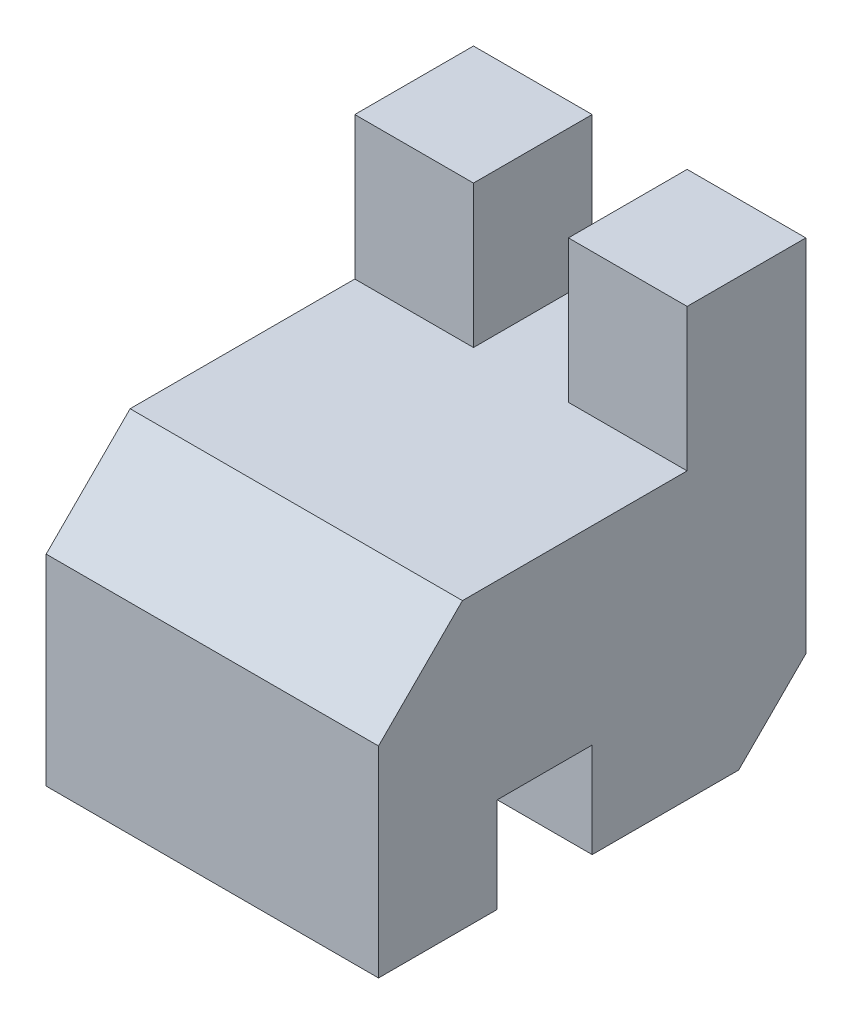
ISO-10303-21;
HEADER;
FILE_DESCRIPTION(('STEP AP214'),'2;1');
FILE_NAME('part.step','',(''),(''),'','','');
FILE_SCHEMA(('AUTOMOTIVE_DESIGN { 1 0 10303 214 1 1 1 1 }'));
ENDSEC;
DATA;
#1=APPLICATION_CONTEXT('core data for automotive mechanical design processes');
#2=APPLICATION_PROTOCOL_DEFINITION('international standard','automotive_design',2000,#1);
#3=PRODUCT_CONTEXT('',#1,'mechanical');
#4=PRODUCT('Part','Part','',(#3));
#5=PRODUCT_RELATED_PRODUCT_CATEGORY('part','',(#4));
#6=PRODUCT_DEFINITION_FORMATION('','',#4);
#7=PRODUCT_DEFINITION_CONTEXT('part definition',#1,'design');
#8=PRODUCT_DEFINITION('design','',#6,#7);
#9=PRODUCT_DEFINITION_SHAPE('','',#8);
#10=(LENGTH_UNIT() NAMED_UNIT(*) SI_UNIT(.MILLI.,.METRE.));
#11=(NAMED_UNIT(*) PLANE_ANGLE_UNIT() SI_UNIT($,.RADIAN.));
#12=(NAMED_UNIT(*) SI_UNIT($,.STERADIAN.) SOLID_ANGLE_UNIT());
#13=UNCERTAINTY_MEASURE_WITH_UNIT(LENGTH_MEASURE(1.E-05),#10,'distance_accuracy_value','');
#14=(GEOMETRIC_REPRESENTATION_CONTEXT(3) GLOBAL_UNCERTAINTY_ASSIGNED_CONTEXT((#13)) GLOBAL_UNIT_ASSIGNED_CONTEXT((#10,
#11,#12)) REPRESENTATION_CONTEXT('',''));
#15=CARTESIAN_POINT('',(0.,0.,0.));
#16=DIRECTION('',(0.,0.,1.));
#17=DIRECTION('',(1.,0.,0.));
#18=AXIS2_PLACEMENT_3D('',#15,#16,#17);
#19=CARTESIAN_POINT('',(-35.,60.,10.8578643762691));
#20=DIRECTION('',(0.,0.,1.));
#21=DIRECTION('',(1.,0.,0.));
#22=AXIS2_PLACEMENT_3D('',#19,#20,#21);
#23=PLANE('',#22);
#24=DIRECTION('',(1.,0.,0.));
#25=VECTOR('',#24,1.);
#26=CARTESIAN_POINT('',(-35.,60.,10.8578643762691));
#27=LINE('',#26,#25);
#28=CARTESIAN_POINT('',(-35.,60.,10.8578643762691));
#29=VERTEX_POINT('',#28);
#30=CARTESIAN_POINT('',(-10.,60.,10.8578643762691));
#31=VERTEX_POINT('',#30);
#32=EDGE_CURVE('E180',#29,#31,#27,.T.);
#33=ORIENTED_EDGE('',*,*,#32,.T.);
#34=DIRECTION('',(0.,1.,0.));
#35=VECTOR('',#34,1.);
#36=CARTESIAN_POINT('',(-10.,60.,10.8578643762691));
#37=LINE('',#36,#35);
#38=CARTESIAN_POINT('',(-10.,90.,10.8578643762691));
#39=VERTEX_POINT('',#38);
#40=EDGE_CURVE('E171',#31,#39,#37,.T.);
#41=ORIENTED_EDGE('',*,*,#40,.T.);
#42=DIRECTION('',(1.,0.,0.));
#43=VECTOR('',#42,1.);
#44=CARTESIAN_POINT('',(-35.,90.,10.8578643762691));
#45=LINE('',#44,#43);
#46=CARTESIAN_POINT('',(-35.,90.,10.8578643762691));
#47=VERTEX_POINT('',#46);
#48=EDGE_CURVE('E181',#47,#39,#45,.T.);
#49=ORIENTED_EDGE('',*,*,#48,.F.);
#50=DIRECTION('',(0.,-1.,0.));
#51=VECTOR('',#50,1.);
#52=CARTESIAN_POINT('',(-35.,60.,10.8578643762691));
#53=LINE('',#52,#51);
#54=EDGE_CURVE('E275',#47,#29,#53,.T.);
#55=ORIENTED_EDGE('',*,*,#54,.T.);
#56=EDGE_LOOP('',(#33,#41,#49,#55));
#57=FACE_BOUND('',#56,.T.);
#58=ADVANCED_FACE('F39',(#57),#23,.T.);
#59=CARTESIAN_POINT('',(10.,90.,10.8578643762691));
#60=VERTEX_POINT('',#59);
#61=CARTESIAN_POINT('',(35.,90.,10.8578643762691));
#62=VERTEX_POINT('',#61);
#63=EDGE_CURVE('E169',#60,#62,#45,.T.);
#64=ORIENTED_EDGE('',*,*,#63,.F.);
#65=DIRECTION('',(0.,-1.,0.));
#66=VECTOR('',#65,1.);
#67=CARTESIAN_POINT('',(10.,60.,10.8578643762691));
#68=LINE('',#67,#66);
#69=CARTESIAN_POINT('',(10.,60.,10.8578643762691));
#70=VERTEX_POINT('',#69);
#71=EDGE_CURVE('E155',#60,#70,#68,.T.);
#72=ORIENTED_EDGE('',*,*,#71,.T.);
#73=CARTESIAN_POINT('',(35.,60.,10.8578643762691));
#74=VERTEX_POINT('',#73);
#75=EDGE_CURVE('E167',#70,#74,#27,.T.);
#76=ORIENTED_EDGE('',*,*,#75,.T.);
#77=DIRECTION('',(0.,-1.,0.));
#78=VECTOR('',#77,1.);
#79=CARTESIAN_POINT('',(35.,60.,10.8578643762691));
#80=LINE('',#79,#78);
#81=EDGE_CURVE('E231',#62,#74,#80,.T.);
#82=ORIENTED_EDGE('',*,*,#81,.F.);
#83=EDGE_LOOP('',(#64,#72,#76,#82));
#84=FACE_BOUND('',#83,.T.);
#85=ADVANCED_FACE('F165',(#84),#23,.T.);
#86=CARTESIAN_POINT('',(-35.,90.,10.8578643762691));
#87=DIRECTION('',(0.,1.,0.));
#88=DIRECTION('',(0.,0.,1.));
#89=AXIS2_PLACEMENT_3D('',#86,#87,#88);
#90=PLANE('',#89);
#91=ORIENTED_EDGE('',*,*,#48,.T.);
#92=DIRECTION('',(0.,0.,-1.));
#93=VECTOR('',#92,1.);
#94=CARTESIAN_POINT('',(-10.,90.,13.));
#95=LINE('',#94,#93);
#96=CARTESIAN_POINT('',(-10.,90.,-14.1421356237309));
#97=VERTEX_POINT('',#96);
#98=EDGE_CURVE('E172',#39,#97,#95,.T.);
#99=ORIENTED_EDGE('',*,*,#98,.T.);
#100=DIRECTION('',(1.,0.,0.));
#101=VECTOR('',#100,1.);
#102=CARTESIAN_POINT('',(-35.,90.,-14.1421356237309));
#103=LINE('',#102,#101);
#104=CARTESIAN_POINT('',(-35.,90.,-14.1421356237309));
#105=VERTEX_POINT('',#104);
#106=EDGE_CURVE('E192',#105,#97,#103,.T.);
#107=ORIENTED_EDGE('',*,*,#106,.F.);
#108=DIRECTION('',(0.,0.,1.));
#109=VECTOR('',#108,1.);
#110=CARTESIAN_POINT('',(-35.,90.,10.8578643762691));
#111=LINE('',#110,#109);
#112=EDGE_CURVE('E271',#105,#47,#111,.T.);
#113=ORIENTED_EDGE('',*,*,#112,.T.);
#114=EDGE_LOOP('',(#91,#99,#107,#113));
#115=FACE_BOUND('',#114,.T.);
#116=ADVANCED_FACE('F355',(#115),#90,.T.);
#117=CARTESIAN_POINT('',(10.,90.,-14.1421356237309));
#118=VERTEX_POINT('',#117);
#119=CARTESIAN_POINT('',(35.,90.,-14.1421356237309));
#120=VERTEX_POINT('',#119);
#121=EDGE_CURVE('E196',#118,#120,#103,.T.);
#122=ORIENTED_EDGE('',*,*,#121,.F.);
#123=DIRECTION('',(0.,0.,-1.));
#124=VECTOR('',#123,1.);
#125=CARTESIAN_POINT('',(10.,90.,13.));
#126=LINE('',#125,#124);
#127=EDGE_CURVE('E55',#60,#118,#126,.T.);
#128=ORIENTED_EDGE('',*,*,#127,.F.);
#129=ORIENTED_EDGE('',*,*,#63,.T.);
#130=DIRECTION('',(0.,0.,1.));
#131=VECTOR('',#130,1.);
#132=CARTESIAN_POINT('',(35.,90.,10.8578643762691));
#133=LINE('',#132,#131);
#134=EDGE_CURVE('E227',#120,#62,#133,.T.);
#135=ORIENTED_EDGE('',*,*,#134,.F.);
#136=EDGE_LOOP('',(#122,#128,#129,#135));
#137=FACE_BOUND('',#136,.T.);
#138=ADVANCED_FACE('F358',(#137),#90,.T.);
#139=CARTESIAN_POINT('',(-35.,90.,-14.1421356237309));
#140=DIRECTION('',(0.,0.,-1.));
#141=DIRECTION('',(0.,1.,0.));
#142=AXIS2_PLACEMENT_3D('',#139,#140,#141);
#143=PLANE('',#142);
#144=ORIENTED_EDGE('',*,*,#106,.T.);
#145=DIRECTION('',(0.,-1.,0.));
#146=VECTOR('',#145,1.);
#147=CARTESIAN_POINT('',(-10.,90.,-14.1421356237309));
#148=LINE('',#147,#146);
#149=CARTESIAN_POINT('',(-10.,60.,-14.1421356237309));
#150=VERTEX_POINT('',#149);
#151=EDGE_CURVE('E11',#97,#150,#148,.T.);
#152=ORIENTED_EDGE('',*,*,#151,.T.);
#153=DIRECTION('',(1.,0.,0.));
#154=VECTOR('',#153,1.);
#155=CARTESIAN_POINT('',(-35.,60.,-14.1421356237309));
#156=LINE('',#155,#154);
#157=CARTESIAN_POINT('',(10.,60.,-14.1421356237309));
#158=VERTEX_POINT('',#157);
#159=EDGE_CURVE('E48',#150,#158,#156,.T.);
#160=ORIENTED_EDGE('',*,*,#159,.T.);
#161=DIRECTION('',(0.,1.,0.));
#162=VECTOR('',#161,1.);
#163=CARTESIAN_POINT('',(10.,90.,-14.1421356237309));
#164=LINE('',#163,#162);
#165=EDGE_CURVE('E156',#158,#118,#164,.T.);
#166=ORIENTED_EDGE('',*,*,#165,.T.);
#167=ORIENTED_EDGE('',*,*,#121,.T.);
#168=DIRECTION('',(0.,1.,0.));
#169=VECTOR('',#168,1.);
#170=CARTESIAN_POINT('',(35.,90.,-14.1421356237309));
#171=LINE('',#170,#169);
#172=CARTESIAN_POINT('',(35.,14.142135623731,-14.1421356237309));
#173=VERTEX_POINT('',#172);
#174=EDGE_CURVE('E223',#173,#120,#171,.T.);
#175=ORIENTED_EDGE('',*,*,#174,.F.);
#176=DIRECTION('',(1.,0.,0.));
#177=VECTOR('',#176,1.);
#178=CARTESIAN_POINT('',(-35.,14.142135623731,-14.1421356237309));
#179=LINE('',#178,#177);
#180=CARTESIAN_POINT('',(-35.,14.142135623731,-14.1421356237309));
#181=VERTEX_POINT('',#180);
#182=EDGE_CURVE('E197',#181,#173,#179,.T.);
#183=ORIENTED_EDGE('',*,*,#182,.F.);
#184=DIRECTION('',(0.,1.,0.));
#185=VECTOR('',#184,1.);
#186=CARTESIAN_POINT('',(-35.,90.,-14.1421356237309));
#187=LINE('',#186,#185);
#188=EDGE_CURVE('E267',#181,#105,#187,.T.);
#189=ORIENTED_EDGE('',*,*,#188,.T.);
#190=EDGE_LOOP('',(#144,#152,#160,#166,#167,#175,#183,#189));
#191=FACE_BOUND('',#190,.T.);
#192=ADVANCED_FACE('F204',(#191),#143,.T.);
#193=CARTESIAN_POINT('',(-35.,14.142135623731,-14.1421356237309));
#194=DIRECTION('',(0.,-0.707106781186545,-0.707106781186551));
#195=DIRECTION('',(0.,0.70710678118655,-0.707106781186545));
#196=AXIS2_PLACEMENT_3D('',#193,#194,#195);
#197=PLANE('',#196);
#198=ORIENTED_EDGE('',*,*,#182,.T.);
#199=DIRECTION('',(0.,0.70710678118655,-0.707106781186545));
#200=VECTOR('',#199,1.);
#201=CARTESIAN_POINT('',(35.,14.142135623731,-14.1421356237309));
#202=LINE('',#201,#200);
#203=CARTESIAN_POINT('',(35.,0.,0.));
#204=VERTEX_POINT('',#203);
#205=EDGE_CURVE('E219',#204,#173,#202,.T.);
#206=ORIENTED_EDGE('',*,*,#205,.F.);
#207=DIRECTION('',(1.,0.,0.));
#208=VECTOR('',#207,1.);
#209=CARTESIAN_POINT('',(-35.,0.,0.));
#210=LINE('',#209,#208);
#211=CARTESIAN_POINT('',(-35.,0.,0.));
#212=VERTEX_POINT('',#211);
#213=EDGE_CURVE('E63',#212,#204,#210,.T.);
#214=ORIENTED_EDGE('',*,*,#213,.F.);
#215=DIRECTION('',(0.,0.70710678118655,-0.707106781186545));
#216=VECTOR('',#215,1.);
#217=CARTESIAN_POINT('',(-35.,14.142135623731,-14.1421356237309));
#218=LINE('',#217,#216);
#219=EDGE_CURVE('E264',#212,#181,#218,.T.);
#220=ORIENTED_EDGE('',*,*,#219,.T.);
#221=EDGE_LOOP('',(#198,#206,#214,#220));
#222=FACE_BOUND('',#221,.T.);
#223=ADVANCED_FACE('F41',(#222),#197,.T.);
#224=CARTESIAN_POINT('',(-35.,0.,0.));
#225=DIRECTION('',(0.,-1.,0.));
#226=DIRECTION('',(0.,0.,-1.));
#227=AXIS2_PLACEMENT_3D('',#224,#225,#226);
#228=PLANE('',#227);
#229=ORIENTED_EDGE('',*,*,#213,.T.);
#230=DIRECTION('',(0.,0.,-1.));
#231=VECTOR('',#230,1.);
#232=CARTESIAN_POINT('',(35.,0.,0.));
#233=LINE('',#232,#231);
#234=CARTESIAN_POINT('',(35.,0.,30.8578643762691));
#235=VERTEX_POINT('',#234);
#236=EDGE_CURVE('E260',#235,#204,#233,.T.);
#237=ORIENTED_EDGE('',*,*,#236,.F.);
#238=DIRECTION('',(1.,0.,0.));
#239=VECTOR('',#238,1.);
#240=CARTESIAN_POINT('',(-35.,0.,30.8578643762691));
#241=LINE('',#240,#239);
#242=CARTESIAN_POINT('',(-35.,0.,30.8578643762691));
#243=VERTEX_POINT('',#242);
#244=EDGE_CURVE('E312',#243,#235,#241,.T.);
#245=ORIENTED_EDGE('',*,*,#244,.F.);
#246=DIRECTION('',(0.,0.,-1.));
#247=VECTOR('',#246,1.);
#248=CARTESIAN_POINT('',(-35.,0.,0.));
#249=LINE('',#248,#247);
#250=EDGE_CURVE('E200',#243,#212,#249,.T.);
#251=ORIENTED_EDGE('',*,*,#250,.T.);
#252=EDGE_LOOP('',(#229,#237,#245,#251));
#253=FACE_BOUND('',#252,.T.);
#254=ADVANCED_FACE('F365',(#253),#228,.T.);
#255=CARTESIAN_POINT('',(-35.,0.,30.8578643762691));
#256=DIRECTION('',(0.,0.,1.));
#257=DIRECTION('',(0.,-1.,0.));
#258=AXIS2_PLACEMENT_3D('',#255,#256,#257);
#259=PLANE('',#258);
#260=ORIENTED_EDGE('',*,*,#244,.T.);
#261=DIRECTION('',(0.,-1.,0.));
#262=VECTOR('',#261,1.);
#263=CARTESIAN_POINT('',(35.,0.,30.8578643762691));
#264=LINE('',#263,#262);
#265=CARTESIAN_POINT('',(35.,20.,30.8578643762691));
#266=VERTEX_POINT('',#265);
#267=EDGE_CURVE('E256',#266,#235,#264,.T.);
#268=ORIENTED_EDGE('',*,*,#267,.F.);
#269=DIRECTION('',(1.,0.,0.));
#270=VECTOR('',#269,1.);
#271=CARTESIAN_POINT('',(-35.,20.,30.8578643762691));
#272=LINE('',#271,#270);
#273=CARTESIAN_POINT('',(-35.,20.,30.8578643762691));
#274=VERTEX_POINT('',#273);
#275=EDGE_CURVE('E315',#274,#266,#272,.T.);
#276=ORIENTED_EDGE('',*,*,#275,.F.);
#277=DIRECTION('',(0.,-1.,0.));
#278=VECTOR('',#277,1.);
#279=CARTESIAN_POINT('',(-35.,0.,30.8578643762691));
#280=LINE('',#279,#278);
#281=EDGE_CURVE('E303',#274,#243,#280,.T.);
#282=ORIENTED_EDGE('',*,*,#281,.T.);
#283=EDGE_LOOP('',(#260,#268,#276,#282));
#284=FACE_BOUND('',#283,.T.);
#285=ADVANCED_FACE('F394',(#284),#259,.T.);
#286=CARTESIAN_POINT('',(-35.,20.,30.8578643762691));
#287=DIRECTION('',(0.,-1.,0.));
#288=DIRECTION('',(0.,0.,-1.));
#289=AXIS2_PLACEMENT_3D('',#286,#287,#288);
#290=PLANE('',#289);
#291=ORIENTED_EDGE('',*,*,#275,.T.);
#292=DIRECTION('',(0.,0.,-1.));
#293=VECTOR('',#292,1.);
#294=CARTESIAN_POINT('',(35.,20.,30.8578643762691));
#295=LINE('',#294,#293);
#296=CARTESIAN_POINT('',(35.,20.,50.8578643762691));
#297=VERTEX_POINT('',#296);
#298=EDGE_CURVE('E252',#297,#266,#295,.T.);
#299=ORIENTED_EDGE('',*,*,#298,.F.);
#300=DIRECTION('',(1.,0.,0.));
#301=VECTOR('',#300,1.);
#302=CARTESIAN_POINT('',(-35.,20.,50.8578643762691));
#303=LINE('',#302,#301);
#304=CARTESIAN_POINT('',(-35.,20.,50.8578643762691));
#305=VERTEX_POINT('',#304);
#306=EDGE_CURVE('E318',#305,#297,#303,.T.);
#307=ORIENTED_EDGE('',*,*,#306,.F.);
#308=DIRECTION('',(0.,0.,-1.));
#309=VECTOR('',#308,1.);
#310=CARTESIAN_POINT('',(-35.,20.,30.8578643762691));
#311=LINE('',#310,#309);
#312=EDGE_CURVE('E299',#305,#274,#311,.T.);
#313=ORIENTED_EDGE('',*,*,#312,.T.);
#314=EDGE_LOOP('',(#291,#299,#307,#313));
#315=FACE_BOUND('',#314,.T.);
#316=ADVANCED_FACE('F389',(#315),#290,.T.);
#317=CARTESIAN_POINT('',(-35.,20.,50.8578643762691));
#318=DIRECTION('',(0.,0.,-1.));
#319=DIRECTION('',(-1.,0.,0.));
#320=AXIS2_PLACEMENT_3D('',#317,#318,#319);
#321=PLANE('',#320);
#322=ORIENTED_EDGE('',*,*,#306,.T.);
#323=DIRECTION('',(0.,1.,0.));
#324=VECTOR('',#323,1.);
#325=CARTESIAN_POINT('',(35.,20.,50.8578643762691));
#326=LINE('',#325,#324);
#327=CARTESIAN_POINT('',(35.,0.,50.8578643762691));
#328=VERTEX_POINT('',#327);
#329=EDGE_CURVE('E248',#328,#297,#326,.T.);
#330=ORIENTED_EDGE('',*,*,#329,.F.);
#331=DIRECTION('',(1.,0.,0.));
#332=VECTOR('',#331,1.);
#333=CARTESIAN_POINT('',(-35.,0.,50.8578643762691));
#334=LINE('',#333,#332);
#335=CARTESIAN_POINT('',(-35.,0.,50.8578643762691));
#336=VERTEX_POINT('',#335);
#337=EDGE_CURVE('E321',#336,#328,#334,.T.);
#338=ORIENTED_EDGE('',*,*,#337,.F.);
#339=DIRECTION('',(0.,1.,0.));
#340=VECTOR('',#339,1.);
#341=CARTESIAN_POINT('',(-35.,20.,50.8578643762691));
#342=LINE('',#341,#340);
#343=EDGE_CURVE('E295',#336,#305,#342,.T.);
#344=ORIENTED_EDGE('',*,*,#343,.T.);
#345=EDGE_LOOP('',(#322,#330,#338,#344));
#346=FACE_BOUND('',#345,.T.);
#347=ADVANCED_FACE('F385',(#346),#321,.T.);
#348=CARTESIAN_POINT('',(-35.,0.,50.8578643762691));
#349=DIRECTION('',(0.,-1.,0.));
#350=DIRECTION('',(0.,0.,-1.));
#351=AXIS2_PLACEMENT_3D('',#348,#349,#350);
#352=PLANE('',#351);
#353=ORIENTED_EDGE('',*,*,#337,.T.);
#354=DIRECTION('',(0.,0.,-1.));
#355=VECTOR('',#354,1.);
#356=CARTESIAN_POINT('',(35.,0.,50.8578643762691));
#357=LINE('',#356,#355);
#358=CARTESIAN_POINT('',(35.,0.,75.8578643762691));
#359=VERTEX_POINT('',#358);
#360=EDGE_CURVE('E244',#359,#328,#357,.T.);
#361=ORIENTED_EDGE('',*,*,#360,.F.);
#362=DIRECTION('',(1.,0.,0.));
#363=VECTOR('',#362,1.);
#364=CARTESIAN_POINT('',(-35.,0.,75.8578643762691));
#365=LINE('',#364,#363);
#366=CARTESIAN_POINT('',(-35.,0.,75.8578643762691));
#367=VERTEX_POINT('',#366);
#368=EDGE_CURVE('E324',#367,#359,#365,.T.);
#369=ORIENTED_EDGE('',*,*,#368,.F.);
#370=DIRECTION('',(0.,0.,-1.));
#371=VECTOR('',#370,1.);
#372=CARTESIAN_POINT('',(-35.,0.,50.8578643762691));
#373=LINE('',#372,#371);
#374=EDGE_CURVE('E291',#367,#336,#373,.T.);
#375=ORIENTED_EDGE('',*,*,#374,.T.);
#376=EDGE_LOOP('',(#353,#361,#369,#375));
#377=FACE_BOUND('',#376,.T.);
#378=ADVANCED_FACE('F346',(#377),#352,.T.);
#379=CARTESIAN_POINT('',(-35.,0.,75.8578643762691));
#380=DIRECTION('',(0.,0.,1.));
#381=DIRECTION('',(0.,-1.,0.));
#382=AXIS2_PLACEMENT_3D('',#379,#380,#381);
#383=PLANE('',#382);
#384=ORIENTED_EDGE('',*,*,#368,.T.);
#385=DIRECTION('',(0.,-1.,0.));
#386=VECTOR('',#385,1.);
#387=CARTESIAN_POINT('',(35.,0.,75.8578643762691));
#388=LINE('',#387,#386);
#389=CARTESIAN_POINT('',(35.,42.3223304703363,75.8578643762691));
#390=VERTEX_POINT('',#389);
#391=EDGE_CURVE('E240',#390,#359,#388,.T.);
#392=ORIENTED_EDGE('',*,*,#391,.F.);
#393=DIRECTION('',(1.,0.,0.));
#394=VECTOR('',#393,1.);
#395=CARTESIAN_POINT('',(-35.,42.3223304703363,75.8578643762691));
#396=LINE('',#395,#394);
#397=CARTESIAN_POINT('',(-35.,42.3223304703363,75.8578643762691));
#398=VERTEX_POINT('',#397);
#399=EDGE_CURVE('E326',#398,#390,#396,.T.);
#400=ORIENTED_EDGE('',*,*,#399,.F.);
#401=DIRECTION('',(0.,-1.,0.));
#402=VECTOR('',#401,1.);
#403=CARTESIAN_POINT('',(-35.,0.,75.8578643762691));
#404=LINE('',#403,#402);
#405=EDGE_CURVE('E287',#398,#367,#404,.T.);
#406=ORIENTED_EDGE('',*,*,#405,.T.);
#407=EDGE_LOOP('',(#384,#392,#400,#406));
#408=FACE_BOUND('',#407,.T.);
#409=ADVANCED_FACE('F338',(#408),#383,.T.);
#410=CARTESIAN_POINT('',(-35.,42.3223304703363,75.8578643762691));
#411=DIRECTION('',(0.,0.707106781186546,0.707106781186549));
#412=DIRECTION('',(0.,-0.707106781186549,0.707106781186546));
#413=AXIS2_PLACEMENT_3D('',#410,#411,#412);
#414=PLANE('',#413);
#415=ORIENTED_EDGE('',*,*,#399,.T.);
#416=DIRECTION('',(0.,-0.707106781186549,0.707106781186546));
#417=VECTOR('',#416,1.);
#418=CARTESIAN_POINT('',(35.,42.3223304703363,75.8578643762691));
#419=LINE('',#418,#417);
#420=CARTESIAN_POINT('',(35.,60.,58.1801948466054));
#421=VERTEX_POINT('',#420);
#422=EDGE_CURVE('E236',#421,#390,#419,.T.);
#423=ORIENTED_EDGE('',*,*,#422,.F.);
#424=DIRECTION('',(1.,0.,0.));
#425=VECTOR('',#424,1.);
#426=CARTESIAN_POINT('',(-35.,60.,58.1801948466054));
#427=LINE('',#426,#425);
#428=CARTESIAN_POINT('',(-35.,60.,58.1801948466054));
#429=VERTEX_POINT('',#428);
#430=EDGE_CURVE('E186',#429,#421,#427,.T.);
#431=ORIENTED_EDGE('',*,*,#430,.F.);
#432=DIRECTION('',(0.,-0.707106781186549,0.707106781186546));
#433=VECTOR('',#432,1.);
#434=CARTESIAN_POINT('',(-35.,42.3223304703363,75.8578643762691));
#435=LINE('',#434,#433);
#436=EDGE_CURVE('E283',#429,#398,#435,.T.);
#437=ORIENTED_EDGE('',*,*,#436,.T.);
#438=EDGE_LOOP('',(#415,#423,#431,#437));
#439=FACE_BOUND('',#438,.T.);
#440=ADVANCED_FACE('F336',(#439),#414,.T.);
#441=CARTESIAN_POINT('',(-35.,60.,58.1801948466054));
#442=DIRECTION('',(0.,1.,0.));
#443=DIRECTION('',(0.,0.,1.));
#444=AXIS2_PLACEMENT_3D('',#441,#442,#443);
#445=PLANE('',#444);
#446=DIRECTION('',(0.,0.,-1.));
#447=VECTOR('',#446,1.);
#448=CARTESIAN_POINT('',(-10.,60.,13.));
#449=LINE('',#448,#447);
#450=EDGE_CURVE('E161',#31,#150,#449,.T.);
#451=ORIENTED_EDGE('',*,*,#450,.F.);
#452=ORIENTED_EDGE('',*,*,#32,.F.);
#453=DIRECTION('',(0.,0.,1.));
#454=VECTOR('',#453,1.);
#455=CARTESIAN_POINT('',(-35.,60.,58.1801948466054));
#456=LINE('',#455,#454);
#457=EDGE_CURVE('E279',#29,#429,#456,.T.);
#458=ORIENTED_EDGE('',*,*,#457,.T.);
#459=ORIENTED_EDGE('',*,*,#430,.T.);
#460=DIRECTION('',(0.,0.,1.));
#461=VECTOR('',#460,1.);
#462=CARTESIAN_POINT('',(35.,60.,58.1801948466054));
#463=LINE('',#462,#461);
#464=EDGE_CURVE('E178',#74,#421,#463,.T.);
#465=ORIENTED_EDGE('',*,*,#464,.F.);
#466=ORIENTED_EDGE('',*,*,#75,.F.);
#467=DIRECTION('',(0.,0.,-1.));
#468=VECTOR('',#467,1.);
#469=CARTESIAN_POINT('',(10.,60.,13.));
#470=LINE('',#469,#468);
#471=EDGE_CURVE('E152',#70,#158,#470,.T.);
#472=ORIENTED_EDGE('',*,*,#471,.T.);
#473=ORIENTED_EDGE('',*,*,#159,.F.);
#474=EDGE_LOOP('',(#451,#452,#458,#459,#465,#466,#472,#473));
#475=FACE_BOUND('',#474,.T.);
#476=ADVANCED_FACE('F176',(#475),#445,.T.);
#477=CARTESIAN_POINT('',(-35.,0.,0.));
#478=DIRECTION('',(-1.,0.,0.));
#479=DIRECTION('',(0.,0.,1.));
#480=AXIS2_PLACEMENT_3D('',#477,#478,#479);
#481=PLANE('',#480);
#482=ORIENTED_EDGE('',*,*,#219,.F.);
#483=ORIENTED_EDGE('',*,*,#250,.F.);
#484=ORIENTED_EDGE('',*,*,#281,.F.);
#485=ORIENTED_EDGE('',*,*,#312,.F.);
#486=ORIENTED_EDGE('',*,*,#343,.F.);
#487=ORIENTED_EDGE('',*,*,#374,.F.);
#488=ORIENTED_EDGE('',*,*,#405,.F.);
#489=ORIENTED_EDGE('',*,*,#436,.F.);
#490=ORIENTED_EDGE('',*,*,#457,.F.);
#491=ORIENTED_EDGE('',*,*,#54,.F.);
#492=ORIENTED_EDGE('',*,*,#112,.F.);
#493=ORIENTED_EDGE('',*,*,#188,.F.);
#494=EDGE_LOOP('',(#482,#483,#484,#485,#486,#487,#488,#489,#490,#491,#492,#493));
#495=FACE_BOUND('',#494,.T.);
#496=ADVANCED_FACE('F344',(#495),#481,.T.);
#497=CARTESIAN_POINT('',(35.,0.,0.));
#498=DIRECTION('',(-1.,0.,0.));
#499=DIRECTION('',(0.,0.,1.));
#500=AXIS2_PLACEMENT_3D('',#497,#498,#499);
#501=PLANE('',#500);
#502=ORIENTED_EDGE('',*,*,#205,.T.);
#503=ORIENTED_EDGE('',*,*,#174,.T.);
#504=ORIENTED_EDGE('',*,*,#134,.T.);
#505=ORIENTED_EDGE('',*,*,#81,.T.);
#506=ORIENTED_EDGE('',*,*,#464,.T.);
#507=ORIENTED_EDGE('',*,*,#422,.T.);
#508=ORIENTED_EDGE('',*,*,#391,.T.);
#509=ORIENTED_EDGE('',*,*,#360,.T.);
#510=ORIENTED_EDGE('',*,*,#329,.T.);
#511=ORIENTED_EDGE('',*,*,#298,.T.);
#512=ORIENTED_EDGE('',*,*,#267,.T.);
#513=ORIENTED_EDGE('',*,*,#236,.T.);
#514=EDGE_LOOP('',(#502,#503,#504,#505,#506,#507,#508,#509,#510,#511,#512,#513));
#515=FACE_BOUND('',#514,.T.);
#516=ADVANCED_FACE('F334',(#515),#501,.F.);
#517=CARTESIAN_POINT('',(-10.,60.,13.));
#518=DIRECTION('',(1.,0.,0.));
#519=DIRECTION('',(0.,0.,-1.));
#520=AXIS2_PLACEMENT_3D('',#517,#518,#519);
#521=PLANE('',#520);
#522=ORIENTED_EDGE('',*,*,#450,.T.);
#523=ORIENTED_EDGE('',*,*,#151,.F.);
#524=ORIENTED_EDGE('',*,*,#98,.F.);
#525=ORIENTED_EDGE('',*,*,#40,.F.);
#526=EDGE_LOOP('',(#522,#523,#524,#525));
#527=FACE_BOUND('',#526,.T.);
#528=ADVANCED_FACE('F208',(#527),#521,.T.);
#529=CARTESIAN_POINT('',(10.,90.,13.));
#530=DIRECTION('',(-1.,0.,0.));
#531=DIRECTION('',(0.,0.,1.));
#532=AXIS2_PLACEMENT_3D('',#529,#530,#531);
#533=PLANE('',#532);
#534=ORIENTED_EDGE('',*,*,#127,.T.);
#535=ORIENTED_EDGE('',*,*,#165,.F.);
#536=ORIENTED_EDGE('',*,*,#471,.F.);
#537=ORIENTED_EDGE('',*,*,#71,.F.);
#538=EDGE_LOOP('',(#534,#535,#536,#537));
#539=FACE_BOUND('',#538,.T.);
#540=ADVANCED_FACE('F154',(#539),#533,.T.);
#541=CLOSED_SHELL('',(#58,#85,#116,#138,#192,#223,#254,#285,#316,#347,#378,#409,#440,#476,#496,
#516,#528,#540));
#542=MANIFOLD_SOLID_BREP('B2',#541);
#543=ADVANCED_BREP_SHAPE_REPRESENTATION('',(#18,#542),#14);
#544=SHAPE_DEFINITION_REPRESENTATION(#9,#543);
ENDSEC;
END-ISO-10303-21;
